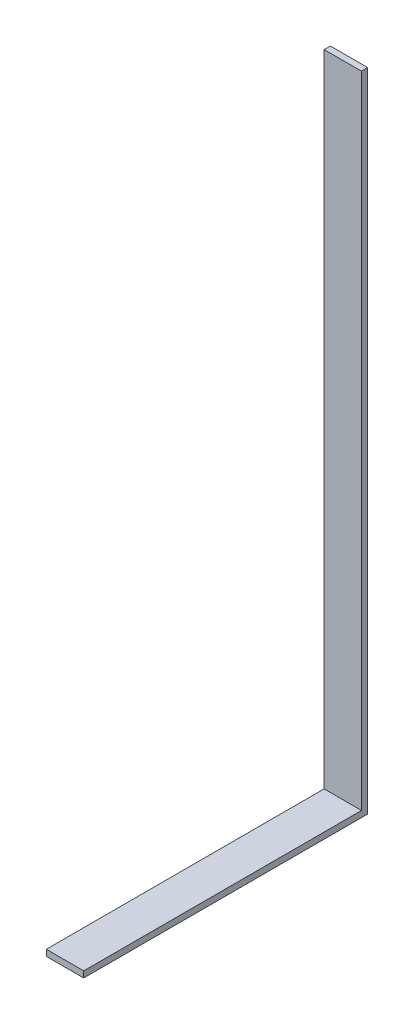
ISO-10303-21;
HEADER;
FILE_DESCRIPTION(('STEP AP214'),'2;1');
FILE_NAME('part.step','',(''),(''),'','','');
FILE_SCHEMA(('AUTOMOTIVE_DESIGN { 1 0 10303 214 1 1 1 1 }'));
ENDSEC;
DATA;
#1=APPLICATION_CONTEXT('core data for automotive mechanical design processes');
#2=APPLICATION_PROTOCOL_DEFINITION('international standard','automotive_design',2000,#1);
#3=PRODUCT_CONTEXT('',#1,'mechanical');
#4=PRODUCT('Part','Part','',(#3));
#5=PRODUCT_RELATED_PRODUCT_CATEGORY('part','',(#4));
#6=PRODUCT_DEFINITION_FORMATION('','',#4);
#7=PRODUCT_DEFINITION_CONTEXT('part definition',#1,'design');
#8=PRODUCT_DEFINITION('design','',#6,#7);
#9=PRODUCT_DEFINITION_SHAPE('','',#8);
#10=(LENGTH_UNIT() NAMED_UNIT(*) SI_UNIT(.MILLI.,.METRE.));
#11=(NAMED_UNIT(*) PLANE_ANGLE_UNIT() SI_UNIT($,.RADIAN.));
#12=(NAMED_UNIT(*) SI_UNIT($,.STERADIAN.) SOLID_ANGLE_UNIT());
#13=UNCERTAINTY_MEASURE_WITH_UNIT(LENGTH_MEASURE(1.E-05),#10,'distance_accuracy_value','');
#14=(GEOMETRIC_REPRESENTATION_CONTEXT(3) GLOBAL_UNCERTAINTY_ASSIGNED_CONTEXT((#13)) GLOBAL_UNIT_ASSIGNED_CONTEXT((#10,
#11,#12)) REPRESENTATION_CONTEXT('',''));
#15=CARTESIAN_POINT('',(0.,0.,0.));
#16=DIRECTION('',(0.,0.,1.));
#17=DIRECTION('',(1.,0.,0.));
#18=AXIS2_PLACEMENT_3D('',#15,#16,#17);
#19=CARTESIAN_POINT('',(19.05,3.155,289.39));
#20=DIRECTION('',(-1.,0.,0.));
#21=DIRECTION('',(0.,0.,1.));
#22=AXIS2_PLACEMENT_3D('',#19,#20,#21);
#23=PLANE('',#22);
#24=DIRECTION('',(0.,0.,-1.));
#25=VECTOR('',#24,1.);
#26=CARTESIAN_POINT('',(19.05,-3.155,289.39));
#27=LINE('',#26,#25);
#28=CARTESIAN_POINT('',(19.05,-3.155,289.39));
#29=VERTEX_POINT('',#28);
#30=CARTESIAN_POINT('',(19.05,-3.155,0.));
#31=VERTEX_POINT('',#30);
#32=EDGE_CURVE('E129',#29,#31,#27,.T.);
#33=ORIENTED_EDGE('',*,*,#32,.T.);
#34=DIRECTION('',(0.,1.,0.));
#35=VECTOR('',#34,1.);
#36=CARTESIAN_POINT('',(19.05,3.155,0.));
#37=LINE('',#36,#35);
#38=CARTESIAN_POINT('',(19.05,655.635,0.));
#39=VERTEX_POINT('',#38);
#40=EDGE_CURVE('E95',#31,#39,#37,.T.);
#41=ORIENTED_EDGE('',*,*,#40,.T.);
#42=DIRECTION('',(0.,0.,1.));
#43=VECTOR('',#42,1.);
#44=CARTESIAN_POINT('',(19.05,655.635,0.));
#45=LINE('',#44,#43);
#46=CARTESIAN_POINT('',(19.05,655.635,6.31));
#47=VERTEX_POINT('',#46);
#48=EDGE_CURVE('E105',#39,#47,#45,.T.);
#49=ORIENTED_EDGE('',*,*,#48,.T.);
#50=DIRECTION('',(0.,-1.,0.));
#51=VECTOR('',#50,1.);
#52=CARTESIAN_POINT('',(19.05,655.635,6.31));
#53=LINE('',#52,#51);
#54=CARTESIAN_POINT('',(19.05,3.155,6.31000000000004));
#55=VERTEX_POINT('',#54);
#56=EDGE_CURVE('E115',#47,#55,#53,.T.);
#57=ORIENTED_EDGE('',*,*,#56,.T.);
#58=DIRECTION('',(0.,0.,-1.));
#59=VECTOR('',#58,1.);
#60=CARTESIAN_POINT('',(19.05,3.155,289.39));
#61=LINE('',#60,#59);
#62=CARTESIAN_POINT('',(19.05,3.155,289.39));
#63=VERTEX_POINT('',#62);
#64=EDGE_CURVE('E11',#63,#55,#61,.T.);
#65=ORIENTED_EDGE('',*,*,#64,.F.);
#66=DIRECTION('',(0.,1.,0.));
#67=VECTOR('',#66,1.);
#68=CARTESIAN_POINT('',(19.05,3.155,289.39));
#69=LINE('',#68,#67);
#70=EDGE_CURVE('E120',#29,#63,#69,.T.);
#71=ORIENTED_EDGE('',*,*,#70,.F.);
#72=EDGE_LOOP('',(#33,#41,#49,#57,#65,#71));
#73=FACE_BOUND('',#72,.T.);
#74=ADVANCED_FACE('F35',(#73),#23,.F.);
#75=CARTESIAN_POINT('',(-19.05,3.155,289.39));
#76=DIRECTION('',(0.,-1.,0.));
#77=DIRECTION('',(0.,0.,-1.));
#78=AXIS2_PLACEMENT_3D('',#75,#76,#77);
#79=PLANE('',#78);
#80=ORIENTED_EDGE('',*,*,#64,.T.);
#81=DIRECTION('',(-1.,0.,0.));
#82=VECTOR('',#81,1.);
#83=CARTESIAN_POINT('',(-19.0499999999999,3.155,6.30999999999998));
#84=LINE('',#83,#82);
#85=CARTESIAN_POINT('',(-19.05,3.155,6.30999999999998));
#86=VERTEX_POINT('',#85);
#87=EDGE_CURVE('E51',#55,#86,#84,.T.);
#88=ORIENTED_EDGE('',*,*,#87,.T.);
#89=DIRECTION('',(0.,0.,-1.));
#90=VECTOR('',#89,1.);
#91=CARTESIAN_POINT('',(-19.05,3.155,289.39));
#92=LINE('',#91,#90);
#93=CARTESIAN_POINT('',(-19.05,3.155,289.39));
#94=VERTEX_POINT('',#93);
#95=EDGE_CURVE('E42',#94,#86,#92,.T.);
#96=ORIENTED_EDGE('',*,*,#95,.F.);
#97=DIRECTION('',(-1.,0.,0.));
#98=VECTOR('',#97,1.);
#99=CARTESIAN_POINT('',(-19.05,3.155,289.39));
#100=LINE('',#99,#98);
#101=EDGE_CURVE('E123',#63,#94,#100,.T.);
#102=ORIENTED_EDGE('',*,*,#101,.F.);
#103=EDGE_LOOP('',(#80,#88,#96,#102));
#104=FACE_BOUND('',#103,.T.);
#105=ADVANCED_FACE('F145',(#104),#79,.F.);
#106=CARTESIAN_POINT('',(-19.05,3.155,289.39));
#107=DIRECTION('',(1.,0.,0.));
#108=DIRECTION('',(0.,0.,-1.));
#109=AXIS2_PLACEMENT_3D('',#106,#107,#108);
#110=PLANE('',#109);
#111=ORIENTED_EDGE('',*,*,#95,.T.);
#112=DIRECTION('',(0.,-1.,0.));
#113=VECTOR('',#112,1.);
#114=CARTESIAN_POINT('',(-19.05,655.635,6.30999999999998));
#115=LINE('',#114,#113);
#116=CARTESIAN_POINT('',(-19.05,655.635,6.30999999999998));
#117=VERTEX_POINT('',#116);
#118=EDGE_CURVE('E109',#117,#86,#115,.T.);
#119=ORIENTED_EDGE('',*,*,#118,.F.);
#120=DIRECTION('',(0.,0.,-1.));
#121=VECTOR('',#120,1.);
#122=CARTESIAN_POINT('',(-19.05,655.635,0.));
#123=LINE('',#122,#121);
#124=CARTESIAN_POINT('',(-19.05,655.635,0.));
#125=VERTEX_POINT('',#124);
#126=EDGE_CURVE('E102',#117,#125,#123,.T.);
#127=ORIENTED_EDGE('',*,*,#126,.T.);
#128=DIRECTION('',(0.,-1.,0.));
#129=VECTOR('',#128,1.);
#130=CARTESIAN_POINT('',(-19.05,3.155,0.));
#131=LINE('',#130,#129);
#132=CARTESIAN_POINT('',(-19.05,-3.155,0.));
#133=VERTEX_POINT('',#132);
#134=EDGE_CURVE('E85',#125,#133,#131,.T.);
#135=ORIENTED_EDGE('',*,*,#134,.T.);
#136=DIRECTION('',(0.,0.,-1.));
#137=VECTOR('',#136,1.);
#138=CARTESIAN_POINT('',(-19.05,-3.155,289.39));
#139=LINE('',#138,#137);
#140=CARTESIAN_POINT('',(-19.05,-3.155,289.39));
#141=VERTEX_POINT('',#140);
#142=EDGE_CURVE('E133',#141,#133,#139,.T.);
#143=ORIENTED_EDGE('',*,*,#142,.F.);
#144=DIRECTION('',(0.,-1.,0.));
#145=VECTOR('',#144,1.);
#146=CARTESIAN_POINT('',(-19.05,3.155,289.39));
#147=LINE('',#146,#145);
#148=EDGE_CURVE('E125',#94,#141,#147,.T.);
#149=ORIENTED_EDGE('',*,*,#148,.F.);
#150=EDGE_LOOP('',(#111,#119,#127,#135,#143,#149));
#151=FACE_BOUND('',#150,.T.);
#152=ADVANCED_FACE('F107',(#151),#110,.F.);
#153=CARTESIAN_POINT('',(-19.05,-3.155,289.39));
#154=DIRECTION('',(0.,1.,0.));
#155=DIRECTION('',(0.,0.,1.));
#156=AXIS2_PLACEMENT_3D('',#153,#154,#155);
#157=PLANE('',#156);
#158=ORIENTED_EDGE('',*,*,#142,.T.);
#159=DIRECTION('',(1.,0.,0.));
#160=VECTOR('',#159,1.);
#161=CARTESIAN_POINT('',(-19.05,-3.155,0.));
#162=LINE('',#161,#160);
#163=EDGE_CURVE('E91',#133,#31,#162,.T.);
#164=ORIENTED_EDGE('',*,*,#163,.T.);
#165=ORIENTED_EDGE('',*,*,#32,.F.);
#166=DIRECTION('',(1.,0.,0.));
#167=VECTOR('',#166,1.);
#168=CARTESIAN_POINT('',(-19.05,-3.155,289.39));
#169=LINE('',#168,#167);
#170=EDGE_CURVE('E127',#141,#29,#169,.T.);
#171=ORIENTED_EDGE('',*,*,#170,.F.);
#172=EDGE_LOOP('',(#158,#164,#165,#171));
#173=FACE_BOUND('',#172,.T.);
#174=ADVANCED_FACE('F142',(#173),#157,.F.);
#175=CARTESIAN_POINT('',(0.,0.,289.39));
#176=DIRECTION('',(0.,0.,1.));
#177=DIRECTION('',(1.,0.,0.));
#178=AXIS2_PLACEMENT_3D('',#175,#176,#177);
#179=PLANE('',#178);
#180=ORIENTED_EDGE('',*,*,#70,.T.);
#181=ORIENTED_EDGE('',*,*,#101,.T.);
#182=ORIENTED_EDGE('',*,*,#148,.T.);
#183=ORIENTED_EDGE('',*,*,#170,.T.);
#184=EDGE_LOOP('',(#180,#181,#182,#183));
#185=FACE_BOUND('',#184,.T.);
#186=ADVANCED_FACE('F144',(#185),#179,.T.);
#187=CARTESIAN_POINT('',(0.,0.,0.));
#188=DIRECTION('',(0.,0.,1.));
#189=DIRECTION('',(1.,0.,0.));
#190=AXIS2_PLACEMENT_3D('',#187,#188,#189);
#191=PLANE('',#190);
#192=ORIENTED_EDGE('',*,*,#40,.F.);
#193=ORIENTED_EDGE('',*,*,#163,.F.);
#194=ORIENTED_EDGE('',*,*,#134,.F.);
#195=DIRECTION('',(1.,0.,0.));
#196=VECTOR('',#195,1.);
#197=CARTESIAN_POINT('',(19.05,655.635,0.));
#198=LINE('',#197,#196);
#199=EDGE_CURVE('E89',#125,#39,#198,.T.);
#200=ORIENTED_EDGE('',*,*,#199,.T.);
#201=EDGE_LOOP('',(#192,#193,#194,#200));
#202=FACE_BOUND('',#201,.T.);
#203=ADVANCED_FACE('F88',(#202),#191,.F.);
#204=CARTESIAN_POINT('',(19.05,655.635,6.31));
#205=DIRECTION('',(0.,0.,1.));
#206=DIRECTION('',(1.,0.,0.));
#207=AXIS2_PLACEMENT_3D('',#204,#205,#206);
#208=PLANE('',#207);
#209=ORIENTED_EDGE('',*,*,#87,.F.);
#210=ORIENTED_EDGE('',*,*,#56,.F.);
#211=DIRECTION('',(-1.,0.,0.));
#212=VECTOR('',#211,1.);
#213=CARTESIAN_POINT('',(19.05,655.635,6.31));
#214=LINE('',#213,#212);
#215=EDGE_CURVE('E113',#47,#117,#214,.T.);
#216=ORIENTED_EDGE('',*,*,#215,.T.);
#217=ORIENTED_EDGE('',*,*,#118,.T.);
#218=EDGE_LOOP('',(#209,#210,#216,#217));
#219=FACE_BOUND('',#218,.T.);
#220=ADVANCED_FACE('F136',(#219),#208,.T.);
#221=CARTESIAN_POINT('',(0.,655.635,0.));
#222=DIRECTION('',(0.,-1.,0.));
#223=DIRECTION('',(0.,0.,-1.));
#224=AXIS2_PLACEMENT_3D('',#221,#222,#223);
#225=PLANE('',#224);
#226=ORIENTED_EDGE('',*,*,#126,.F.);
#227=ORIENTED_EDGE('',*,*,#215,.F.);
#228=ORIENTED_EDGE('',*,*,#48,.F.);
#229=ORIENTED_EDGE('',*,*,#199,.F.);
#230=EDGE_LOOP('',(#226,#227,#228,#229));
#231=FACE_BOUND('',#230,.T.);
#232=ADVANCED_FACE('F100',(#231),#225,.F.);
#233=CLOSED_SHELL('',(#74,#105,#152,#174,#186,#203,#220,#232));
#234=MANIFOLD_SOLID_BREP('B2',#233);
#235=ADVANCED_BREP_SHAPE_REPRESENTATION('',(#18,#234),#14);
#236=SHAPE_DEFINITION_REPRESENTATION(#9,#235);
ENDSEC;
END-ISO-10303-21;
